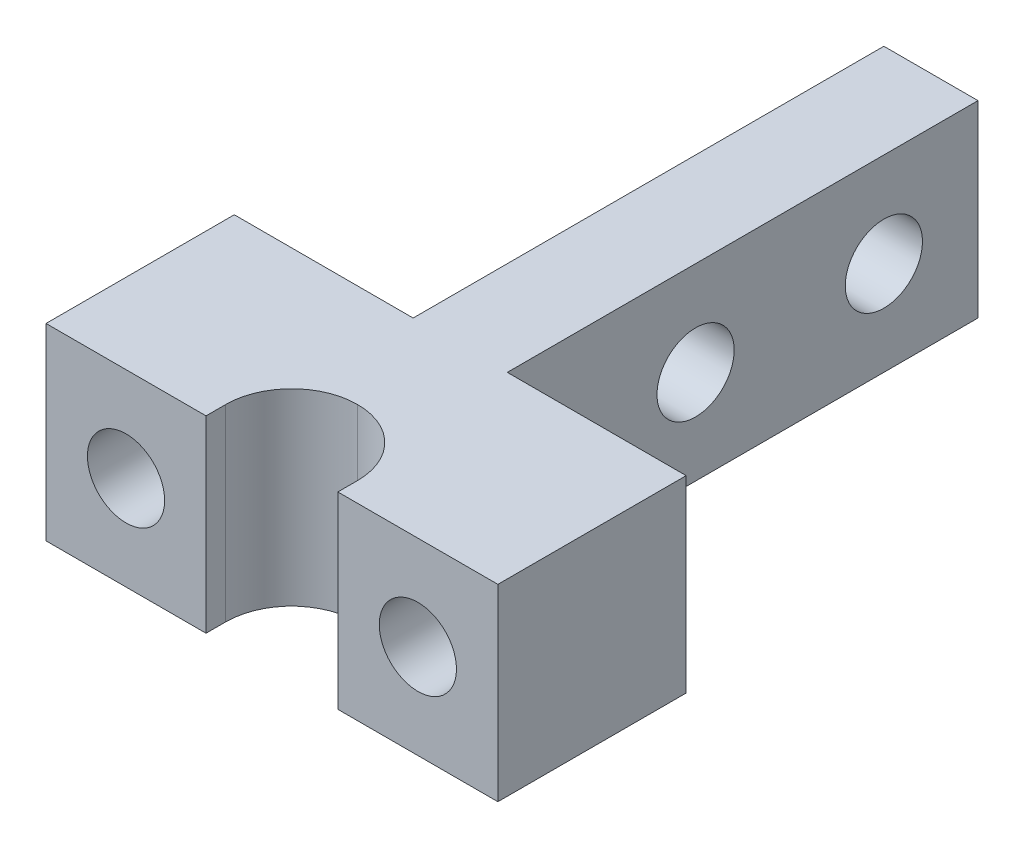
ISO-10303-21;
HEADER;
FILE_DESCRIPTION(('STEP AP214'),'2;1');
FILE_NAME('part.step','',(''),(''),'','','');
FILE_SCHEMA(('AUTOMOTIVE_DESIGN { 1 0 10303 214 1 1 1 1 }'));
ENDSEC;
DATA;
#1=APPLICATION_CONTEXT('core data for automotive mechanical design processes');
#2=APPLICATION_PROTOCOL_DEFINITION('international standard','automotive_design',2000,#1);
#3=PRODUCT_CONTEXT('',#1,'mechanical');
#4=PRODUCT('Part','Part','',(#3));
#5=PRODUCT_RELATED_PRODUCT_CATEGORY('part','',(#4));
#6=PRODUCT_DEFINITION_FORMATION('','',#4);
#7=PRODUCT_DEFINITION_CONTEXT('part definition',#1,'design');
#8=PRODUCT_DEFINITION('design','',#6,#7);
#9=PRODUCT_DEFINITION_SHAPE('','',#8);
#10=(LENGTH_UNIT() NAMED_UNIT(*) SI_UNIT(.MILLI.,.METRE.));
#11=(NAMED_UNIT(*) PLANE_ANGLE_UNIT() SI_UNIT($,.RADIAN.));
#12=(NAMED_UNIT(*) SI_UNIT($,.STERADIAN.) SOLID_ANGLE_UNIT());
#13=UNCERTAINTY_MEASURE_WITH_UNIT(LENGTH_MEASURE(1.E-05),#10,'distance_accuracy_value','');
#14=(GEOMETRIC_REPRESENTATION_CONTEXT(3) GLOBAL_UNCERTAINTY_ASSIGNED_CONTEXT((#13)) GLOBAL_UNIT_ASSIGNED_CONTEXT((#10,
#11,#12)) REPRESENTATION_CONTEXT('',''));
#15=CARTESIAN_POINT('',(0.,0.,0.));
#16=DIRECTION('',(0.,0.,1.));
#17=DIRECTION('',(1.,0.,0.));
#18=AXIS2_PLACEMENT_3D('',#15,#16,#17);
#19=CARTESIAN_POINT('',(-3.98601398601399,20.,-8.6013986013986));
#20=DIRECTION('',(0.,0.,1.));
#21=DIRECTION('',(1.,0.,0.));
#22=AXIS2_PLACEMENT_3D('',#19,#20,#21);
#23=PLANE('',#22);
#24=CARTESIAN_POINT('',(-14.486013986014,10.,-8.6013986013986));
#25=DIRECTION('',(0.,0.,1.));
#26=DIRECTION('',(1.,0.,0.));
#27=AXIS2_PLACEMENT_3D('',#24,#25,#26);
#28=CIRCLE('',#27,4.1);
#29=CARTESIAN_POINT('',(-10.386013986014,10.,-8.6013986013986));
#30=VERTEX_POINT('',#29);
#31=EDGE_CURVE('E209',#30,#30,#28,.T.);
#32=ORIENTED_EDGE('',*,*,#31,.T.);
#33=EDGE_LOOP('',(#32));
#34=FACE_BOUND('',#33,.T.);
#35=DIRECTION('',(-1.,0.,0.));
#36=VECTOR('',#35,1.);
#37=CARTESIAN_POINT('',(-3.98601398601399,0.,-8.6013986013986));
#38=LINE('',#37,#36);
#39=CARTESIAN_POINT('',(-3.98601398601399,0.,-8.6013986013986));
#40=VERTEX_POINT('',#39);
#41=CARTESIAN_POINT('',(-22.986013986014,0.,-8.6013986013986));
#42=VERTEX_POINT('',#41);
#43=EDGE_CURVE('E152',#40,#42,#38,.T.);
#44=ORIENTED_EDGE('',*,*,#43,.T.);
#45=DIRECTION('',(0.,-1.,0.));
#46=VECTOR('',#45,1.);
#47=CARTESIAN_POINT('',(-22.986013986014,20.,-8.6013986013986));
#48=LINE('',#47,#46);
#49=CARTESIAN_POINT('',(-22.986013986014,20.,-8.6013986013986));
#50=VERTEX_POINT('',#49);
#51=EDGE_CURVE('E134',#50,#42,#48,.T.);
#52=ORIENTED_EDGE('',*,*,#51,.F.);
#53=DIRECTION('',(-1.,0.,0.));
#54=VECTOR('',#53,1.);
#55=CARTESIAN_POINT('',(-3.98601398601399,20.,-8.6013986013986));
#56=LINE('',#55,#54);
#57=CARTESIAN_POINT('',(-3.98601398601399,20.,-8.6013986013986));
#58=VERTEX_POINT('',#57);
#59=EDGE_CURVE('E140',#58,#50,#56,.T.);
#60=ORIENTED_EDGE('',*,*,#59,.F.);
#61=DIRECTION('',(0.,-1.,0.));
#62=VECTOR('',#61,1.);
#63=CARTESIAN_POINT('',(-3.98601398601399,20.,-8.6013986013986));
#64=LINE('',#63,#62);
#65=EDGE_CURVE('E228',#58,#40,#64,.T.);
#66=ORIENTED_EDGE('',*,*,#65,.T.);
#67=EDGE_LOOP('',(#44,#52,#60,#66));
#68=FACE_BOUND('',#67,.T.);
#69=ADVANCED_FACE('F35',(#34,#68),#23,.F.);
#70=CARTESIAN_POINT('',(-22.986013986014,20.,-8.6013986013986));
#71=DIRECTION('',(1.,0.,0.));
#72=DIRECTION('',(0.,0.,-1.));
#73=AXIS2_PLACEMENT_3D('',#70,#71,#72);
#74=PLANE('',#73);
#75=DIRECTION('',(0.,0.,1.));
#76=VECTOR('',#75,1.);
#77=CARTESIAN_POINT('',(-22.986013986014,0.,-8.6013986013986));
#78=LINE('',#77,#76);
#79=CARTESIAN_POINT('',(-22.986013986014,0.,11.3986013986014));
#80=VERTEX_POINT('',#79);
#81=EDGE_CURVE('E230',#42,#80,#78,.T.);
#82=ORIENTED_EDGE('',*,*,#81,.T.);
#83=DIRECTION('',(0.,-1.,0.));
#84=VECTOR('',#83,1.);
#85=CARTESIAN_POINT('',(-22.986013986014,20.,11.3986013986014));
#86=LINE('',#85,#84);
#87=CARTESIAN_POINT('',(-22.986013986014,20.,11.3986013986014));
#88=VERTEX_POINT('',#87);
#89=EDGE_CURVE('E137',#88,#80,#86,.T.);
#90=ORIENTED_EDGE('',*,*,#89,.F.);
#91=DIRECTION('',(0.,0.,1.));
#92=VECTOR('',#91,1.);
#93=CARTESIAN_POINT('',(-22.986013986014,20.,-8.6013986013986));
#94=LINE('',#93,#92);
#95=EDGE_CURVE('E130',#50,#88,#94,.T.);
#96=ORIENTED_EDGE('',*,*,#95,.F.);
#97=ORIENTED_EDGE('',*,*,#51,.T.);
#98=EDGE_LOOP('',(#82,#90,#96,#97));
#99=FACE_BOUND('',#98,.T.);
#100=ADVANCED_FACE('F132',(#99),#74,.F.);
#101=CARTESIAN_POINT('',(-22.986013986014,20.,11.3986013986014));
#102=DIRECTION('',(0.,0.,-1.));
#103=DIRECTION('',(-1.,0.,0.));
#104=AXIS2_PLACEMENT_3D('',#101,#102,#103);
#105=PLANE('',#104);
#106=CARTESIAN_POINT('',(-14.486013986014,10.,11.3986013986014));
#107=DIRECTION('',(0.,0.,1.));
#108=DIRECTION('',(1.,0.,0.));
#109=AXIS2_PLACEMENT_3D('',#106,#107,#108);
#110=CIRCLE('',#109,4.1);
#111=CARTESIAN_POINT('',(-10.386013986014,10.,11.3986013986014));
#112=VERTEX_POINT('',#111);
#113=EDGE_CURVE('E165',#112,#112,#110,.T.);
#114=ORIENTED_EDGE('',*,*,#113,.F.);
#115=EDGE_LOOP('',(#114));
#116=FACE_BOUND('',#115,.T.);
#117=DIRECTION('',(1.,0.,0.));
#118=VECTOR('',#117,1.);
#119=CARTESIAN_POINT('',(-22.986013986014,0.,11.3986013986014));
#120=LINE('',#119,#118);
#121=CARTESIAN_POINT('',(-5.98601398601399,0.,11.3986013986014));
#122=VERTEX_POINT('',#121);
#123=EDGE_CURVE('E194',#80,#122,#120,.T.);
#124=ORIENTED_EDGE('',*,*,#123,.T.);
#125=DIRECTION('',(0.,-1.,0.));
#126=VECTOR('',#125,1.);
#127=CARTESIAN_POINT('',(-5.98601398601399,20.,11.3986013986014));
#128=LINE('',#127,#126);
#129=CARTESIAN_POINT('',(-5.98601398601399,20.,11.3986013986014));
#130=VERTEX_POINT('',#129);
#131=EDGE_CURVE('E158',#130,#122,#128,.T.);
#132=ORIENTED_EDGE('',*,*,#131,.F.);
#133=DIRECTION('',(1.,0.,0.));
#134=VECTOR('',#133,1.);
#135=CARTESIAN_POINT('',(-22.986013986014,20.,11.3986013986014));
#136=LINE('',#135,#134);
#137=EDGE_CURVE('E139',#88,#130,#136,.T.);
#138=ORIENTED_EDGE('',*,*,#137,.F.);
#139=ORIENTED_EDGE('',*,*,#89,.T.);
#140=EDGE_LOOP('',(#124,#132,#138,#139));
#141=FACE_BOUND('',#140,.T.);
#142=ADVANCED_FACE('F300',(#116,#141),#105,.F.);
#143=CARTESIAN_POINT('',(-5.98601398601399,20.,11.3986013986014));
#144=DIRECTION('',(-1.,0.,0.));
#145=DIRECTION('',(0.,0.,1.));
#146=AXIS2_PLACEMENT_3D('',#143,#144,#145);
#147=PLANE('',#146);
#148=DIRECTION('',(0.,0.,-1.));
#149=VECTOR('',#148,1.);
#150=CARTESIAN_POINT('',(-5.98601398601399,0.,11.3986013986014));
#151=LINE('',#150,#149);
#152=CARTESIAN_POINT('',(-5.98601398601399,0.,9.30769230769231));
#153=VERTEX_POINT('',#152);
#154=EDGE_CURVE('E184',#122,#153,#151,.T.);
#155=ORIENTED_EDGE('',*,*,#154,.T.);
#156=DIRECTION('',(0.,-1.,0.));
#157=VECTOR('',#156,1.);
#158=CARTESIAN_POINT('',(-5.98601398601399,20.,9.30769230769231));
#159=LINE('',#158,#157);
#160=CARTESIAN_POINT('',(-5.98601398601399,20.,9.30769230769231));
#161=VERTEX_POINT('',#160);
#162=EDGE_CURVE('E153',#153,#161,#159,.F.);
#163=ORIENTED_EDGE('',*,*,#162,.T.);
#164=DIRECTION('',(0.,0.,-1.));
#165=VECTOR('',#164,1.);
#166=CARTESIAN_POINT('',(-5.98601398601399,20.,11.3986013986014));
#167=LINE('',#166,#165);
#168=EDGE_CURVE('E213',#130,#161,#167,.T.);
#169=ORIENTED_EDGE('',*,*,#168,.F.);
#170=ORIENTED_EDGE('',*,*,#131,.T.);
#171=EDGE_LOOP('',(#155,#163,#169,#170));
#172=FACE_BOUND('',#171,.T.);
#173=ADVANCED_FACE('F190',(#172),#147,.F.);
#174=CARTESIAN_POINT('',(8.01398601398601,20.,2.30769230769231));
#175=DIRECTION('',(1.,0.,0.));
#176=DIRECTION('',(0.,0.,-1.));
#177=AXIS2_PLACEMENT_3D('',#174,#175,#176);
#178=PLANE('',#177);
#179=DIRECTION('',(0.,0.,1.));
#180=VECTOR('',#179,1.);
#181=CARTESIAN_POINT('',(8.01398601398601,20.,2.30769230769231));
#182=LINE('',#181,#180);
#183=CARTESIAN_POINT('',(8.01398601398601,20.,9.30769230769231));
#184=VERTEX_POINT('',#183);
#185=CARTESIAN_POINT('',(8.01398601398601,20.,11.3986013986014));
#186=VERTEX_POINT('',#185);
#187=EDGE_CURVE('E215',#184,#186,#182,.T.);
#188=ORIENTED_EDGE('',*,*,#187,.F.);
#189=DIRECTION('',(0.,-1.,0.));
#190=VECTOR('',#189,1.);
#191=CARTESIAN_POINT('',(8.01398601398601,0.,9.30769230769231));
#192=LINE('',#191,#190);
#193=CARTESIAN_POINT('',(8.01398601398601,0.,9.30769230769231));
#194=VERTEX_POINT('',#193);
#195=EDGE_CURVE('E156',#184,#194,#192,.T.);
#196=ORIENTED_EDGE('',*,*,#195,.T.);
#197=DIRECTION('',(0.,0.,1.));
#198=VECTOR('',#197,1.);
#199=CARTESIAN_POINT('',(8.01398601398601,0.,2.30769230769231));
#200=LINE('',#199,#198);
#201=CARTESIAN_POINT('',(8.01398601398601,0.,11.3986013986014));
#202=VERTEX_POINT('',#201);
#203=EDGE_CURVE('E193',#194,#202,#200,.T.);
#204=ORIENTED_EDGE('',*,*,#203,.T.);
#205=DIRECTION('',(0.,-1.,0.));
#206=VECTOR('',#205,1.);
#207=CARTESIAN_POINT('',(8.01398601398601,20.,11.3986013986014));
#208=LINE('',#207,#206);
#209=EDGE_CURVE('E261',#186,#202,#208,.T.);
#210=ORIENTED_EDGE('',*,*,#209,.F.);
#211=EDGE_LOOP('',(#188,#196,#204,#210));
#212=FACE_BOUND('',#211,.T.);
#213=ADVANCED_FACE('F285',(#212),#178,.F.);
#214=CARTESIAN_POINT('',(8.01398601398601,20.,11.3986013986014));
#215=DIRECTION('',(0.,0.,-1.));
#216=DIRECTION('',(-1.,0.,0.));
#217=AXIS2_PLACEMENT_3D('',#214,#215,#216);
#218=PLANE('',#217);
#219=CARTESIAN_POINT('',(16.513986013986,10.,11.3986013986014));
#220=DIRECTION('',(0.,0.,1.));
#221=DIRECTION('',(1.,0.,0.));
#222=AXIS2_PLACEMENT_3D('',#219,#220,#221);
#223=CIRCLE('',#222,4.1);
#224=CARTESIAN_POINT('',(20.613986013986,10.,11.3986013986014));
#225=VERTEX_POINT('',#224);
#226=EDGE_CURVE('E166',#225,#225,#223,.T.);
#227=ORIENTED_EDGE('',*,*,#226,.F.);
#228=EDGE_LOOP('',(#227));
#229=FACE_BOUND('',#228,.T.);
#230=DIRECTION('',(1.,0.,0.));
#231=VECTOR('',#230,1.);
#232=CARTESIAN_POINT('',(8.01398601398601,0.,11.3986013986014));
#233=LINE('',#232,#231);
#234=CARTESIAN_POINT('',(25.013986013986,0.,11.3986013986014));
#235=VERTEX_POINT('',#234);
#236=EDGE_CURVE('E234',#202,#235,#233,.T.);
#237=ORIENTED_EDGE('',*,*,#236,.T.);
#238=DIRECTION('',(0.,-1.,0.));
#239=VECTOR('',#238,1.);
#240=CARTESIAN_POINT('',(25.013986013986,20.,11.3986013986014));
#241=LINE('',#240,#239);
#242=CARTESIAN_POINT('',(25.013986013986,20.,11.3986013986014));
#243=VERTEX_POINT('',#242);
#244=EDGE_CURVE('E258',#243,#235,#241,.T.);
#245=ORIENTED_EDGE('',*,*,#244,.F.);
#246=DIRECTION('',(1.,0.,0.));
#247=VECTOR('',#246,1.);
#248=CARTESIAN_POINT('',(8.01398601398601,20.,11.3986013986014));
#249=LINE('',#248,#247);
#250=EDGE_CURVE('E217',#186,#243,#249,.T.);
#251=ORIENTED_EDGE('',*,*,#250,.F.);
#252=ORIENTED_EDGE('',*,*,#209,.T.);
#253=EDGE_LOOP('',(#237,#245,#251,#252));
#254=FACE_BOUND('',#253,.T.);
#255=ADVANCED_FACE('F267',(#229,#254),#218,.F.);
#256=CARTESIAN_POINT('',(25.013986013986,20.,11.3986013986014));
#257=DIRECTION('',(-1.,0.,0.));
#258=DIRECTION('',(0.,0.,1.));
#259=AXIS2_PLACEMENT_3D('',#256,#257,#258);
#260=PLANE('',#259);
#261=DIRECTION('',(0.,0.,-1.));
#262=VECTOR('',#261,1.);
#263=CARTESIAN_POINT('',(25.013986013986,0.,11.3986013986014));
#264=LINE('',#263,#262);
#265=CARTESIAN_POINT('',(25.013986013986,0.,-8.6013986013986));
#266=VERTEX_POINT('',#265);
#267=EDGE_CURVE('E236',#235,#266,#264,.T.);
#268=ORIENTED_EDGE('',*,*,#267,.T.);
#269=DIRECTION('',(0.,-1.,0.));
#270=VECTOR('',#269,1.);
#271=CARTESIAN_POINT('',(25.013986013986,20.,-8.6013986013986));
#272=LINE('',#271,#270);
#273=CARTESIAN_POINT('',(25.013986013986,20.,-8.6013986013986));
#274=VERTEX_POINT('',#273);
#275=EDGE_CURVE('E255',#274,#266,#272,.T.);
#276=ORIENTED_EDGE('',*,*,#275,.F.);
#277=DIRECTION('',(0.,0.,-1.));
#278=VECTOR('',#277,1.);
#279=CARTESIAN_POINT('',(25.013986013986,20.,11.3986013986014));
#280=LINE('',#279,#278);
#281=EDGE_CURVE('E219',#243,#274,#280,.T.);
#282=ORIENTED_EDGE('',*,*,#281,.F.);
#283=ORIENTED_EDGE('',*,*,#244,.T.);
#284=EDGE_LOOP('',(#268,#276,#282,#283));
#285=FACE_BOUND('',#284,.T.);
#286=ADVANCED_FACE('F276',(#285),#260,.F.);
#287=CARTESIAN_POINT('',(25.013986013986,20.,-8.6013986013986));
#288=DIRECTION('',(0.,0.,1.));
#289=DIRECTION('',(1.,0.,0.));
#290=AXIS2_PLACEMENT_3D('',#287,#288,#289);
#291=PLANE('',#290);
#292=CARTESIAN_POINT('',(16.513986013986,10.,-8.6013986013986));
#293=DIRECTION('',(0.,0.,1.));
#294=DIRECTION('',(1.,0.,0.));
#295=AXIS2_PLACEMENT_3D('',#292,#293,#294);
#296=CIRCLE('',#295,4.1);
#297=CARTESIAN_POINT('',(20.613986013986,10.,-8.6013986013986));
#298=VERTEX_POINT('',#297);
#299=EDGE_CURVE('E162',#298,#298,#296,.T.);
#300=ORIENTED_EDGE('',*,*,#299,.T.);
#301=EDGE_LOOP('',(#300));
#302=FACE_BOUND('',#301,.T.);
#303=DIRECTION('',(-1.,0.,0.));
#304=VECTOR('',#303,1.);
#305=CARTESIAN_POINT('',(25.013986013986,0.,-8.6013986013986));
#306=LINE('',#305,#304);
#307=CARTESIAN_POINT('',(6.01398601398601,0.,-8.6013986013986));
#308=VERTEX_POINT('',#307);
#309=EDGE_CURVE('E238',#266,#308,#306,.T.);
#310=ORIENTED_EDGE('',*,*,#309,.T.);
#311=DIRECTION('',(0.,-1.,0.));
#312=VECTOR('',#311,1.);
#313=CARTESIAN_POINT('',(6.01398601398601,20.,-8.6013986013986));
#314=LINE('',#313,#312);
#315=CARTESIAN_POINT('',(6.01398601398601,20.,-8.6013986013986));
#316=VERTEX_POINT('',#315);
#317=EDGE_CURVE('E252',#316,#308,#314,.T.);
#318=ORIENTED_EDGE('',*,*,#317,.F.);
#319=DIRECTION('',(-1.,0.,0.));
#320=VECTOR('',#319,1.);
#321=CARTESIAN_POINT('',(25.013986013986,20.,-8.6013986013986));
#322=LINE('',#321,#320);
#323=EDGE_CURVE('E221',#274,#316,#322,.T.);
#324=ORIENTED_EDGE('',*,*,#323,.F.);
#325=ORIENTED_EDGE('',*,*,#275,.T.);
#326=EDGE_LOOP('',(#310,#318,#324,#325));
#327=FACE_BOUND('',#326,.T.);
#328=ADVANCED_FACE('F280',(#302,#327),#291,.F.);
#329=CARTESIAN_POINT('',(6.01398601398601,20.,-8.6013986013986));
#330=DIRECTION('',(-1.,0.,0.));
#331=DIRECTION('',(0.,0.,1.));
#332=AXIS2_PLACEMENT_3D('',#329,#330,#331);
#333=PLANE('',#332);
#334=CARTESIAN_POINT('',(6.01398601398602,10.,-48.6013986013986));
#335=DIRECTION('',(1.,0.,0.));
#336=DIRECTION('',(0.,0.,-1.));
#337=AXIS2_PLACEMENT_3D('',#334,#335,#336);
#338=CIRCLE('',#337,4.1);
#339=CARTESIAN_POINT('',(6.01398601398602,10.,-52.7013986013986));
#340=VERTEX_POINT('',#339);
#341=EDGE_CURVE('E173',#340,#340,#338,.T.);
#342=ORIENTED_EDGE('',*,*,#341,.F.);
#343=EDGE_LOOP('',(#342));
#344=FACE_BOUND('',#343,.T.);
#345=CARTESIAN_POINT('',(6.01398601398601,10.,-28.6013986013986));
#346=DIRECTION('',(1.,0.,0.));
#347=DIRECTION('',(0.,0.,-1.));
#348=AXIS2_PLACEMENT_3D('',#345,#346,#347);
#349=CIRCLE('',#348,4.1);
#350=CARTESIAN_POINT('',(6.01398601398601,10.,-32.7013986013986));
#351=VERTEX_POINT('',#350);
#352=EDGE_CURVE('E170',#351,#351,#349,.T.);
#353=ORIENTED_EDGE('',*,*,#352,.F.);
#354=EDGE_LOOP('',(#353));
#355=FACE_BOUND('',#354,.T.);
#356=DIRECTION('',(0.,0.,-1.));
#357=VECTOR('',#356,1.);
#358=CARTESIAN_POINT('',(6.01398601398601,0.,-8.6013986013986));
#359=LINE('',#358,#357);
#360=CARTESIAN_POINT('',(6.01398601398602,0.,-58.6013986013986));
#361=VERTEX_POINT('',#360);
#362=EDGE_CURVE('E240',#308,#361,#359,.T.);
#363=ORIENTED_EDGE('',*,*,#362,.T.);
#364=DIRECTION('',(0.,-1.,0.));
#365=VECTOR('',#364,1.);
#366=CARTESIAN_POINT('',(6.01398601398602,20.,-58.6013986013986));
#367=LINE('',#366,#365);
#368=CARTESIAN_POINT('',(6.01398601398602,20.,-58.6013986013986));
#369=VERTEX_POINT('',#368);
#370=EDGE_CURVE('E249',#369,#361,#367,.T.);
#371=ORIENTED_EDGE('',*,*,#370,.F.);
#372=DIRECTION('',(0.,0.,-1.));
#373=VECTOR('',#372,1.);
#374=CARTESIAN_POINT('',(6.01398601398601,20.,-8.6013986013986));
#375=LINE('',#374,#373);
#376=EDGE_CURVE('E223',#316,#369,#375,.T.);
#377=ORIENTED_EDGE('',*,*,#376,.F.);
#378=ORIENTED_EDGE('',*,*,#317,.T.);
#379=EDGE_LOOP('',(#363,#371,#377,#378));
#380=FACE_BOUND('',#379,.T.);
#381=ADVANCED_FACE('F317',(#344,#355,#380),#333,.F.);
#382=CARTESIAN_POINT('',(6.01398601398602,20.,-58.6013986013986));
#383=DIRECTION('',(0.,0.,1.));
#384=DIRECTION('',(1.,0.,0.));
#385=AXIS2_PLACEMENT_3D('',#382,#383,#384);
#386=PLANE('',#385);
#387=DIRECTION('',(-1.,0.,0.));
#388=VECTOR('',#387,1.);
#389=CARTESIAN_POINT('',(6.01398601398602,0.,-58.6013986013986));
#390=LINE('',#389,#388);
#391=CARTESIAN_POINT('',(-3.98601398601399,0.,-58.6013986013986));
#392=VERTEX_POINT('',#391);
#393=EDGE_CURVE('E242',#361,#392,#390,.T.);
#394=ORIENTED_EDGE('',*,*,#393,.T.);
#395=DIRECTION('',(0.,-1.,0.));
#396=VECTOR('',#395,1.);
#397=CARTESIAN_POINT('',(-3.98601398601399,20.,-58.6013986013986));
#398=LINE('',#397,#396);
#399=CARTESIAN_POINT('',(-3.98601398601399,20.,-58.6013986013986));
#400=VERTEX_POINT('',#399);
#401=EDGE_CURVE('E246',#400,#392,#398,.T.);
#402=ORIENTED_EDGE('',*,*,#401,.F.);
#403=DIRECTION('',(-1.,0.,0.));
#404=VECTOR('',#403,1.);
#405=CARTESIAN_POINT('',(6.01398601398602,20.,-58.6013986013986));
#406=LINE('',#405,#404);
#407=EDGE_CURVE('E225',#369,#400,#406,.T.);
#408=ORIENTED_EDGE('',*,*,#407,.F.);
#409=ORIENTED_EDGE('',*,*,#370,.T.);
#410=EDGE_LOOP('',(#394,#402,#408,#409));
#411=FACE_BOUND('',#410,.T.);
#412=ADVANCED_FACE('F321',(#411),#386,.F.);
#413=CARTESIAN_POINT('',(-3.98601398601399,20.,-58.6013986013986));
#414=DIRECTION('',(1.,0.,0.));
#415=DIRECTION('',(0.,0.,-1.));
#416=AXIS2_PLACEMENT_3D('',#413,#414,#415);
#417=PLANE('',#416);
#418=CARTESIAN_POINT('',(-3.98601398601399,10.,-48.6013986013986));
#419=DIRECTION('',(1.,0.,0.));
#420=DIRECTION('',(0.,0.,-1.));
#421=AXIS2_PLACEMENT_3D('',#418,#419,#420);
#422=CIRCLE('',#421,4.1);
#423=CARTESIAN_POINT('',(-3.98601398601399,10.,-52.7013986013986));
#424=VERTEX_POINT('',#423);
#425=EDGE_CURVE('E171',#424,#424,#422,.T.);
#426=ORIENTED_EDGE('',*,*,#425,.T.);
#427=EDGE_LOOP('',(#426));
#428=FACE_BOUND('',#427,.T.);
#429=CARTESIAN_POINT('',(-3.98601398601399,10.,-28.6013986013986));
#430=DIRECTION('',(1.,0.,0.));
#431=DIRECTION('',(0.,0.,-1.));
#432=AXIS2_PLACEMENT_3D('',#429,#430,#431);
#433=CIRCLE('',#432,4.1);
#434=CARTESIAN_POINT('',(-3.98601398601398,10.,-32.7013986013986));
#435=VERTEX_POINT('',#434);
#436=EDGE_CURVE('E167',#435,#435,#433,.T.);
#437=ORIENTED_EDGE('',*,*,#436,.T.);
#438=EDGE_LOOP('',(#437));
#439=FACE_BOUND('',#438,.T.);
#440=DIRECTION('',(0.,0.,1.));
#441=VECTOR('',#440,1.);
#442=CARTESIAN_POINT('',(-3.98601398601399,0.,-58.6013986013986));
#443=LINE('',#442,#441);
#444=EDGE_CURVE('E149',#392,#40,#443,.T.);
#445=ORIENTED_EDGE('',*,*,#444,.T.);
#446=ORIENTED_EDGE('',*,*,#65,.F.);
#447=DIRECTION('',(0.,0.,1.));
#448=VECTOR('',#447,1.);
#449=CARTESIAN_POINT('',(-3.98601398601399,20.,-58.6013986013986));
#450=LINE('',#449,#448);
#451=EDGE_CURVE('E145',#400,#58,#450,.T.);
#452=ORIENTED_EDGE('',*,*,#451,.F.);
#453=ORIENTED_EDGE('',*,*,#401,.T.);
#454=EDGE_LOOP('',(#445,#446,#452,#453));
#455=FACE_BOUND('',#454,.T.);
#456=ADVANCED_FACE('F325',(#428,#439,#455),#417,.F.);
#457=CARTESIAN_POINT('',(0.,20.,0.));
#458=DIRECTION('',(0.,1.,0.));
#459=DIRECTION('',(0.,0.,1.));
#460=AXIS2_PLACEMENT_3D('',#457,#458,#459);
#461=PLANE('',#460);
#462=ORIENTED_EDGE('',*,*,#59,.T.);
#463=ORIENTED_EDGE('',*,*,#95,.T.);
#464=ORIENTED_EDGE('',*,*,#137,.T.);
#465=ORIENTED_EDGE('',*,*,#168,.T.);
#466=CARTESIAN_POINT('',(1.01398601398601,20.,9.30769230769231));
#467=DIRECTION('',(0.,1.,0.));
#468=DIRECTION('',(0.,0.,1.));
#469=AXIS2_PLACEMENT_3D('',#466,#467,#468);
#470=CIRCLE('',#469,7.);
#471=CARTESIAN_POINT('',(1.01398601398601,20.,2.30769230769231));
#472=VERTEX_POINT('',#471);
#473=EDGE_CURVE('E50',#161,#472,#470,.F.);
#474=ORIENTED_EDGE('',*,*,#473,.T.);
#475=CARTESIAN_POINT('',(1.01398601398601,20.,9.30769230769231));
#476=DIRECTION('',(0.,1.,0.));
#477=DIRECTION('',(0.,0.,1.));
#478=AXIS2_PLACEMENT_3D('',#475,#476,#477);
#479=CIRCLE('',#478,7.);
#480=EDGE_CURVE('E11',#472,#184,#479,.F.);
#481=ORIENTED_EDGE('',*,*,#480,.T.);
#482=ORIENTED_EDGE('',*,*,#187,.T.);
#483=ORIENTED_EDGE('',*,*,#250,.T.);
#484=ORIENTED_EDGE('',*,*,#281,.T.);
#485=ORIENTED_EDGE('',*,*,#323,.T.);
#486=ORIENTED_EDGE('',*,*,#376,.T.);
#487=ORIENTED_EDGE('',*,*,#407,.T.);
#488=ORIENTED_EDGE('',*,*,#451,.T.);
#489=EDGE_LOOP('',(#462,#463,#464,#465,#474,#481,#482,#483,#484,#485,#486,#487,#488));
#490=FACE_BOUND('',#489,.T.);
#491=ADVANCED_FACE('F143',(#490),#461,.T.);
#492=CARTESIAN_POINT('',(0.,0.,0.));
#493=DIRECTION('',(0.,1.,0.));
#494=DIRECTION('',(0.,0.,1.));
#495=AXIS2_PLACEMENT_3D('',#492,#493,#494);
#496=PLANE('',#495);
#497=ORIENTED_EDGE('',*,*,#43,.F.);
#498=ORIENTED_EDGE('',*,*,#444,.F.);
#499=ORIENTED_EDGE('',*,*,#393,.F.);
#500=ORIENTED_EDGE('',*,*,#362,.F.);
#501=ORIENTED_EDGE('',*,*,#309,.F.);
#502=ORIENTED_EDGE('',*,*,#267,.F.);
#503=ORIENTED_EDGE('',*,*,#236,.F.);
#504=ORIENTED_EDGE('',*,*,#203,.F.);
#505=CARTESIAN_POINT('',(1.01398601398601,0.,9.30769230769231));
#506=DIRECTION('',(0.,1.,0.));
#507=DIRECTION('',(0.,0.,1.));
#508=AXIS2_PLACEMENT_3D('',#505,#506,#507);
#509=CIRCLE('',#508,7.);
#510=CARTESIAN_POINT('',(1.01398601398601,0.,2.30769230769231));
#511=VERTEX_POINT('',#510);
#512=EDGE_CURVE('E44',#194,#511,#509,.T.);
#513=ORIENTED_EDGE('',*,*,#512,.T.);
#514=CARTESIAN_POINT('',(1.01398601398601,0.,9.30769230769231));
#515=DIRECTION('',(0.,1.,0.));
#516=DIRECTION('',(0.,0.,1.));
#517=AXIS2_PLACEMENT_3D('',#514,#515,#516);
#518=CIRCLE('',#517,7.);
#519=EDGE_CURVE('E176',#511,#153,#518,.T.);
#520=ORIENTED_EDGE('',*,*,#519,.T.);
#521=ORIENTED_EDGE('',*,*,#154,.F.);
#522=ORIENTED_EDGE('',*,*,#123,.F.);
#523=ORIENTED_EDGE('',*,*,#81,.F.);
#524=EDGE_LOOP('',(#497,#498,#499,#500,#501,#502,#503,#504,#513,#520,#521,#522,#523));
#525=FACE_BOUND('',#524,.T.);
#526=ADVANCED_FACE('F182',(#525),#496,.F.);
#527=CARTESIAN_POINT('',(-14.486013986014,10.,-58.6013986013986));
#528=DIRECTION('',(0.,0.,1.));
#529=DIRECTION('',(1.,0.,0.));
#530=AXIS2_PLACEMENT_3D('',#527,#528,#529);
#531=CYLINDRICAL_SURFACE('',#530,4.1);
#532=ORIENTED_EDGE('',*,*,#113,.T.);
#533=EDGE_LOOP('',(#532));
#534=FACE_BOUND('',#533,.T.);
#535=ORIENTED_EDGE('',*,*,#31,.F.);
#536=EDGE_LOOP('',(#535));
#537=FACE_BOUND('',#536,.T.);
#538=ADVANCED_FACE('F332',(#534,#537),#531,.F.);
#539=CARTESIAN_POINT('',(16.513986013986,10.,-58.6013986013986));
#540=DIRECTION('',(0.,0.,1.));
#541=DIRECTION('',(1.,0.,0.));
#542=AXIS2_PLACEMENT_3D('',#539,#540,#541);
#543=CYLINDRICAL_SURFACE('',#542,4.1);
#544=ORIENTED_EDGE('',*,*,#226,.T.);
#545=EDGE_LOOP('',(#544));
#546=FACE_BOUND('',#545,.T.);
#547=ORIENTED_EDGE('',*,*,#299,.F.);
#548=EDGE_LOOP('',(#547));
#549=FACE_BOUND('',#548,.T.);
#550=ADVANCED_FACE('F337',(#546,#549),#543,.F.);
#551=CARTESIAN_POINT('',(-22.986013986014,10.,-28.6013986013986));
#552=DIRECTION('',(1.,0.,0.));
#553=DIRECTION('',(0.,0.,-1.));
#554=AXIS2_PLACEMENT_3D('',#551,#552,#553);
#555=CYLINDRICAL_SURFACE('',#554,4.1);
#556=CARTESIAN_POINT('',(6.01398601398601,10.,-32.7013986013986));
#557=CARTESIAN_POINT('',(5.90981934731935,10.,-32.7013986013986));
#558=CARTESIAN_POINT('',(5.80565268065268,10.,-32.7013986013986));
#559=CARTESIAN_POINT('',(5.59731934731935,10.,-32.7013986013986));
#560=CARTESIAN_POINT('',(5.49315268065268,10.,-32.7013986013986));
#561=CARTESIAN_POINT('',(5.28481934731935,10.,-32.7013986013986));
#562=CARTESIAN_POINT('',(5.18065268065268,10.,-32.7013986013986));
#563=CARTESIAN_POINT('',(4.97231934731935,10.,-32.7013986013986));
#564=CARTESIAN_POINT('',(4.86815268065268,10.,-32.7013986013986));
#565=CARTESIAN_POINT('',(4.65981934731935,10.,-32.7013986013986));
#566=CARTESIAN_POINT('',(4.55565268065268,10.,-32.7013986013986));
#567=CARTESIAN_POINT('',(4.34731934731935,10.,-32.7013986013986));
#568=CARTESIAN_POINT('',(4.24315268065268,10.,-32.7013986013986));
#569=CARTESIAN_POINT('',(4.03481934731935,10.,-32.7013986013986));
#570=CARTESIAN_POINT('',(3.93065268065268,10.,-32.7013986013986));
#571=CARTESIAN_POINT('',(3.72231934731935,10.,-32.7013986013986));
#572=CARTESIAN_POINT('',(3.61815268065268,10.,-32.7013986013986));
#573=CARTESIAN_POINT('',(3.40981934731935,10.,-32.7013986013986));
#574=CARTESIAN_POINT('',(3.30565268065268,10.,-32.7013986013986));
#575=CARTESIAN_POINT('',(3.09731934731935,10.,-32.7013986013986));
#576=CARTESIAN_POINT('',(2.99315268065268,10.,-32.7013986013986));
#577=CARTESIAN_POINT('',(2.78481934731935,10.,-32.7013986013986));
#578=CARTESIAN_POINT('',(2.68065268065268,10.,-32.7013986013986));
#579=CARTESIAN_POINT('',(2.47231934731935,10.,-32.7013986013986));
#580=CARTESIAN_POINT('',(2.36815268065268,10.,-32.7013986013986));
#581=CARTESIAN_POINT('',(2.15981934731935,10.,-32.7013986013986));
#582=CARTESIAN_POINT('',(2.05565268065268,10.,-32.7013986013986));
#583=CARTESIAN_POINT('',(1.84731934731935,10.,-32.7013986013986));
#584=CARTESIAN_POINT('',(1.74315268065268,10.,-32.7013986013986));
#585=CARTESIAN_POINT('',(1.53481934731935,10.,-32.7013986013986));
#586=CARTESIAN_POINT('',(1.43065268065268,10.,-32.7013986013986));
#587=CARTESIAN_POINT('',(1.22231934731935,10.,-32.7013986013986));
#588=CARTESIAN_POINT('',(1.11815268065268,10.,-32.7013986013986));
#589=CARTESIAN_POINT('',(0.909819347319348,10.,-32.7013986013986));
#590=CARTESIAN_POINT('',(0.805652680652682,10.,-32.7013986013986));
#591=CARTESIAN_POINT('',(0.597319347319348,10.,-32.7013986013986));
#592=CARTESIAN_POINT('',(0.493152680652681,10.,-32.7013986013986));
#593=CARTESIAN_POINT('',(0.284819347319348,10.,-32.7013986013986));
#594=CARTESIAN_POINT('',(0.180652680652681,10.,-32.7013986013986));
#595=CARTESIAN_POINT('',(-0.0276806526806524,10.,-32.7013986013986));
#596=CARTESIAN_POINT('',(-0.131847319347319,10.,-32.7013986013986));
#597=CARTESIAN_POINT('',(-0.340180652680653,10.,-32.7013986013986));
#598=CARTESIAN_POINT('',(-0.444347319347319,10.,-32.7013986013986));
#599=CARTESIAN_POINT('',(-0.652680652680652,10.,-32.7013986013986));
#600=CARTESIAN_POINT('',(-0.756847319347317,10.,-32.7013986013986));
#601=CARTESIAN_POINT('',(-0.96518065268065,10.,-32.7013986013986));
#602=CARTESIAN_POINT('',(-1.06934731934732,10.,-32.7013986013986));
#603=CARTESIAN_POINT('',(-1.27768065268065,10.,-32.7013986013986));
#604=CARTESIAN_POINT('',(-1.38184731934732,10.,-32.7013986013986));
#605=CARTESIAN_POINT('',(-1.59018065268065,10.,-32.7013986013986));
#606=CARTESIAN_POINT('',(-1.69434731934732,10.,-32.7013986013986));
#607=CARTESIAN_POINT('',(-1.90268065268065,10.,-32.7013986013986));
#608=CARTESIAN_POINT('',(-2.00684731934732,10.,-32.7013986013986));
#609=CARTESIAN_POINT('',(-2.21518065268065,10.,-32.7013986013986));
#610=CARTESIAN_POINT('',(-2.31934731934732,10.,-32.7013986013986));
#611=CARTESIAN_POINT('',(-2.52768065268065,10.,-32.7013986013986));
#612=CARTESIAN_POINT('',(-2.63184731934731,10.,-32.7013986013986));
#613=CARTESIAN_POINT('',(-2.84018065268065,10.,-32.7013986013986));
#614=CARTESIAN_POINT('',(-2.94434731934731,10.,-32.7013986013986));
#615=CARTESIAN_POINT('',(-3.15268065268065,10.,-32.7013986013986));
#616=CARTESIAN_POINT('',(-3.25684731934731,10.,-32.7013986013986));
#617=CARTESIAN_POINT('',(-3.46518065268065,10.,-32.7013986013986));
#618=CARTESIAN_POINT('',(-3.56934731934732,10.,-32.7013986013986));
#619=CARTESIAN_POINT('',(-3.77768065268065,10.,-32.7013986013986));
#620=CARTESIAN_POINT('',(-3.88184731934732,10.,-32.7013986013986));
#621=CARTESIAN_POINT('',(-3.98601398601398,10.,-32.7013986013986));
#622=B_SPLINE_CURVE_WITH_KNOTS('',3,(#556,#557,#558,#559,#560,#561,#562,#563,#564,#565,#566,
#567,#568,#569,#570,#571,#572,#573,#574,#575,#576,#577,#578,#579,#580,#581,#582,#583,#584,#585,
#586,#587,#588,#589,#590,#591,#592,#593,#594,#595,#596,#597,#598,#599,#600,#601,#602,#603,#604,
#605,#606,#607,#608,#609,#610,#611,#612,#613,#614,#615,#616,#617,#618,#619,#620,#621),
.UNSPECIFIED.,.F.,.F.,(4,2,2,2,2,2,2,2,2,2,2,2,2,2,2,2,2,2,2,2,2,2,2,2,2,2,2,2,2,2,2,2,4),(0.,
0.3125,0.625000000000001,0.937500000000001,1.25,1.5625,1.875,2.1875,2.5,2.8125,3.125,3.4375,
3.75,4.0625,4.375,4.6875,5.,5.3125,5.625,5.9375,6.25,6.5625,6.875,7.1875,7.5,7.8125,8.125,
8.43749999999999,8.74999999999999,9.06249999999999,9.37499999999999,9.68749999999999,
9.99999999999999),.UNSPECIFIED.);
#623=EDGE_CURVE('BSEAM292',#351,#435,#622,.T.);
#624=ORIENTED_EDGE('',*,*,#352,.T.);
#625=ORIENTED_EDGE('',*,*,#436,.F.);
#626=ORIENTED_EDGE('',*,*,#623,.T.);
#627=ORIENTED_EDGE('',*,*,#623,.F.);
#628=EDGE_LOOP('',(#624,#626,#625,#627));
#629=FACE_BOUND('',#628,.T.);
#630=ADVANCED_FACE('F292',(#629),#555,.F.);
#631=CARTESIAN_POINT('',(-22.986013986014,10.,-48.6013986013986));
#632=DIRECTION('',(1.,0.,0.));
#633=DIRECTION('',(0.,0.,-1.));
#634=AXIS2_PLACEMENT_3D('',#631,#632,#633);
#635=CYLINDRICAL_SURFACE('',#634,4.1);
#636=CARTESIAN_POINT('',(6.01398601398602,10.,-52.7013986013986));
#637=CARTESIAN_POINT('',(5.90981934731935,10.,-52.7013986013986));
#638=CARTESIAN_POINT('',(5.80565268065268,10.,-52.7013986013986));
#639=CARTESIAN_POINT('',(5.59731934731935,10.,-52.7013986013986));
#640=CARTESIAN_POINT('',(5.49315268065268,10.,-52.7013986013986));
#641=CARTESIAN_POINT('',(5.28481934731935,10.,-52.7013986013986));
#642=CARTESIAN_POINT('',(5.18065268065268,10.,-52.7013986013986));
#643=CARTESIAN_POINT('',(4.97231934731935,10.,-52.7013986013986));
#644=CARTESIAN_POINT('',(4.86815268065268,10.,-52.7013986013986));
#645=CARTESIAN_POINT('',(4.65981934731935,10.,-52.7013986013986));
#646=CARTESIAN_POINT('',(4.55565268065268,10.,-52.7013986013986));
#647=CARTESIAN_POINT('',(4.34731934731935,10.,-52.7013986013986));
#648=CARTESIAN_POINT('',(4.24315268065268,10.,-52.7013986013986));
#649=CARTESIAN_POINT('',(4.03481934731935,10.,-52.7013986013986));
#650=CARTESIAN_POINT('',(3.93065268065268,10.,-52.7013986013986));
#651=CARTESIAN_POINT('',(3.72231934731935,10.,-52.7013986013986));
#652=CARTESIAN_POINT('',(3.61815268065268,10.,-52.7013986013986));
#653=CARTESIAN_POINT('',(3.40981934731935,10.,-52.7013986013986));
#654=CARTESIAN_POINT('',(3.30565268065268,10.,-52.7013986013986));
#655=CARTESIAN_POINT('',(3.09731934731935,10.,-52.7013986013986));
#656=CARTESIAN_POINT('',(2.99315268065268,10.,-52.7013986013986));
#657=CARTESIAN_POINT('',(2.78481934731935,10.,-52.7013986013986));
#658=CARTESIAN_POINT('',(2.68065268065268,10.,-52.7013986013986));
#659=CARTESIAN_POINT('',(2.47231934731935,10.,-52.7013986013986));
#660=CARTESIAN_POINT('',(2.36815268065268,10.,-52.7013986013986));
#661=CARTESIAN_POINT('',(2.15981934731935,10.,-52.7013986013986));
#662=CARTESIAN_POINT('',(2.05565268065268,10.,-52.7013986013986));
#663=CARTESIAN_POINT('',(1.84731934731935,10.,-52.7013986013986));
#664=CARTESIAN_POINT('',(1.74315268065268,10.,-52.7013986013986));
#665=CARTESIAN_POINT('',(1.53481934731935,10.,-52.7013986013986));
#666=CARTESIAN_POINT('',(1.43065268065268,10.,-52.7013986013986));
#667=CARTESIAN_POINT('',(1.22231934731935,10.,-52.7013986013986));
#668=CARTESIAN_POINT('',(1.11815268065268,10.,-52.7013986013986));
#669=CARTESIAN_POINT('',(0.909819347319348,10.,-52.7013986013986));
#670=CARTESIAN_POINT('',(0.805652680652682,10.,-52.7013986013986));
#671=CARTESIAN_POINT('',(0.597319347319348,10.,-52.7013986013986));
#672=CARTESIAN_POINT('',(0.493152680652681,10.,-52.7013986013986));
#673=CARTESIAN_POINT('',(0.284819347319348,10.,-52.7013986013986));
#674=CARTESIAN_POINT('',(0.180652680652681,10.,-52.7013986013986));
#675=CARTESIAN_POINT('',(-0.0276806526806524,10.,-52.7013986013986));
#676=CARTESIAN_POINT('',(-0.131847319347319,10.,-52.7013986013986));
#677=CARTESIAN_POINT('',(-0.340180652680653,10.,-52.7013986013986));
#678=CARTESIAN_POINT('',(-0.444347319347319,10.,-52.7013986013986));
#679=CARTESIAN_POINT('',(-0.652680652680652,10.,-52.7013986013986));
#680=CARTESIAN_POINT('',(-0.756847319347317,10.,-52.7013986013986));
#681=CARTESIAN_POINT('',(-0.96518065268065,10.,-52.7013986013986));
#682=CARTESIAN_POINT('',(-1.06934731934732,10.,-52.7013986013986));
#683=CARTESIAN_POINT('',(-1.27768065268065,10.,-52.7013986013986));
#684=CARTESIAN_POINT('',(-1.38184731934732,10.,-52.7013986013986));
#685=CARTESIAN_POINT('',(-1.59018065268065,10.,-52.7013986013986));
#686=CARTESIAN_POINT('',(-1.69434731934732,10.,-52.7013986013986));
#687=CARTESIAN_POINT('',(-1.90268065268065,10.,-52.7013986013986));
#688=CARTESIAN_POINT('',(-2.00684731934732,10.,-52.7013986013986));
#689=CARTESIAN_POINT('',(-2.21518065268065,10.,-52.7013986013986));
#690=CARTESIAN_POINT('',(-2.31934731934732,10.,-52.7013986013986));
#691=CARTESIAN_POINT('',(-2.52768065268065,10.,-52.7013986013986));
#692=CARTESIAN_POINT('',(-2.63184731934732,10.,-52.7013986013986));
#693=CARTESIAN_POINT('',(-2.84018065268065,10.,-52.7013986013986));
#694=CARTESIAN_POINT('',(-2.94434731934732,10.,-52.7013986013986));
#695=CARTESIAN_POINT('',(-3.15268065268065,10.,-52.7013986013986));
#696=CARTESIAN_POINT('',(-3.25684731934732,10.,-52.7013986013986));
#697=CARTESIAN_POINT('',(-3.46518065268065,10.,-52.7013986013986));
#698=CARTESIAN_POINT('',(-3.56934731934732,10.,-52.7013986013986));
#699=CARTESIAN_POINT('',(-3.77768065268065,10.,-52.7013986013986));
#700=CARTESIAN_POINT('',(-3.88184731934732,10.,-52.7013986013986));
#701=CARTESIAN_POINT('',(-3.98601398601399,10.,-52.7013986013986));
#702=B_SPLINE_CURVE_WITH_KNOTS('',3,(#636,#637,#638,#639,#640,#641,#642,#643,#644,#645,#646,
#647,#648,#649,#650,#651,#652,#653,#654,#655,#656,#657,#658,#659,#660,#661,#662,#663,#664,#665,
#666,#667,#668,#669,#670,#671,#672,#673,#674,#675,#676,#677,#678,#679,#680,#681,#682,#683,#684,
#685,#686,#687,#688,#689,#690,#691,#692,#693,#694,#695,#696,#697,#698,#699,#700,#701),
.UNSPECIFIED.,.F.,.F.,(4,2,2,2,2,2,2,2,2,2,2,2,2,2,2,2,2,2,2,2,2,2,2,2,2,2,2,2,2,2,2,2,4),(0.,
0.3125,0.625000000000001,0.937500000000001,1.25,1.5625,1.875,2.1875,2.5,2.8125,3.125,3.4375,
3.75,4.0625,4.375,4.6875,5.,5.3125,5.625,5.9375,6.25,6.5625,6.875,7.1875,7.5,7.8125,8.125,
8.4375,8.75,9.0625,9.375,9.6875,10.),.UNSPECIFIED.);
#703=EDGE_CURVE('BSEAM287',#340,#424,#702,.T.);
#704=ORIENTED_EDGE('',*,*,#341,.T.);
#705=ORIENTED_EDGE('',*,*,#425,.F.);
#706=ORIENTED_EDGE('',*,*,#703,.T.);
#707=ORIENTED_EDGE('',*,*,#703,.F.);
#708=EDGE_LOOP('',(#704,#706,#705,#707));
#709=FACE_BOUND('',#708,.T.);
#710=ADVANCED_FACE('F287',(#709),#635,.F.);
#711=CARTESIAN_POINT('',(1.01398601398601,20.,9.30769230769231));
#712=DIRECTION('',(0.,1.,0.));
#713=DIRECTION('',(0.,0.,1.));
#714=AXIS2_PLACEMENT_3D('',#711,#712,#713);
#715=CYLINDRICAL_SURFACE('',#714,7.);
#716=ORIENTED_EDGE('',*,*,#195,.F.);
#717=ORIENTED_EDGE('',*,*,#480,.F.);
#718=DIRECTION('',(0.,-1.,0.));
#719=VECTOR('',#718,1.);
#720=CARTESIAN_POINT('',(1.01398601398601,20.,2.30769230769231));
#721=LINE('',#720,#719);
#722=EDGE_CURVE('E39',#511,#472,#721,.F.);
#723=ORIENTED_EDGE('',*,*,#722,.F.);
#724=ORIENTED_EDGE('',*,*,#512,.F.);
#725=EDGE_LOOP('',(#716,#717,#723,#724));
#726=FACE_BOUND('',#725,.T.);
#727=ADVANCED_FACE('F37',(#726),#715,.F.);
#728=CARTESIAN_POINT('',(1.01398601398601,20.,9.30769230769231));
#729=DIRECTION('',(0.,1.,0.));
#730=DIRECTION('',(0.,0.,1.));
#731=AXIS2_PLACEMENT_3D('',#728,#729,#730);
#732=CYLINDRICAL_SURFACE('',#731,7.);
#733=ORIENTED_EDGE('',*,*,#473,.F.);
#734=ORIENTED_EDGE('',*,*,#162,.F.);
#735=ORIENTED_EDGE('',*,*,#519,.F.);
#736=ORIENTED_EDGE('',*,*,#722,.T.);
#737=EDGE_LOOP('',(#733,#734,#735,#736));
#738=FACE_BOUND('',#737,.T.);
#739=ADVANCED_FACE('F196',(#738),#732,.F.);
#740=CLOSED_SHELL('',(#69,#100,#142,#173,#213,#255,#286,#328,#381,#412,#456,#491,#526,#538,#550,
#630,#710,#727,#739));
#741=MANIFOLD_SOLID_BREP('B2',#740);
#742=ADVANCED_BREP_SHAPE_REPRESENTATION('',(#18,#741),#14);
#743=SHAPE_DEFINITION_REPRESENTATION(#9,#742);
ENDSEC;
END-ISO-10303-21;
